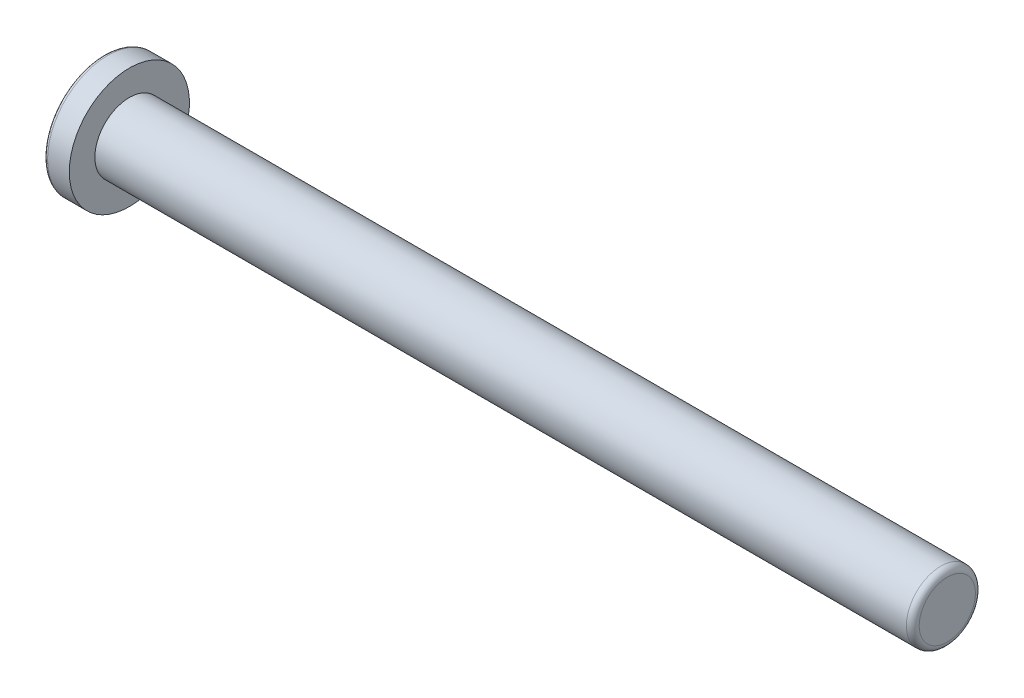
ISO-10303-21;
HEADER;
FILE_DESCRIPTION(('STEP AP214'),'2;1');
FILE_NAME('part.step','',(''),(''),'','','');
FILE_SCHEMA(('AUTOMOTIVE_DESIGN { 1 0 10303 214 1 1 1 1 }'));
ENDSEC;
DATA;
#1=APPLICATION_CONTEXT('core data for automotive mechanical design processes');
#2=APPLICATION_PROTOCOL_DEFINITION('international standard','automotive_design',2000,#1);
#3=PRODUCT_CONTEXT('',#1,'mechanical');
#4=PRODUCT('Part','Part','',(#3));
#5=PRODUCT_RELATED_PRODUCT_CATEGORY('part','',(#4));
#6=PRODUCT_DEFINITION_FORMATION('','',#4);
#7=PRODUCT_DEFINITION_CONTEXT('part definition',#1,'design');
#8=PRODUCT_DEFINITION('design','',#6,#7);
#9=PRODUCT_DEFINITION_SHAPE('','',#8);
#10=(LENGTH_UNIT() NAMED_UNIT(*) SI_UNIT(.MILLI.,.METRE.));
#11=(NAMED_UNIT(*) PLANE_ANGLE_UNIT() SI_UNIT($,.RADIAN.));
#12=(NAMED_UNIT(*) SI_UNIT($,.STERADIAN.) SOLID_ANGLE_UNIT());
#13=UNCERTAINTY_MEASURE_WITH_UNIT(LENGTH_MEASURE(1.E-05),#10,'distance_accuracy_value','');
#14=(GEOMETRIC_REPRESENTATION_CONTEXT(3) GLOBAL_UNCERTAINTY_ASSIGNED_CONTEXT((#13)) GLOBAL_UNIT_ASSIGNED_CONTEXT((#10,
#11,#12)) REPRESENTATION_CONTEXT('',''));
#15=CARTESIAN_POINT('',(0.,0.,0.));
#16=DIRECTION('',(0.,0.,1.));
#17=DIRECTION('',(1.,0.,0.));
#18=AXIS2_PLACEMENT_3D('',#15,#16,#17);
#19=CARTESIAN_POINT('',(0.,0.,0.));
#20=DIRECTION('',(-1.,0.,0.));
#21=DIRECTION('',(0.,0.,1.));
#22=AXIS2_PLACEMENT_3D('',#19,#20,#21);
#23=PLANE('',#22);
#24=CARTESIAN_POINT('',(0.,0.,0.));
#25=DIRECTION('',(-1.,0.,0.));
#26=DIRECTION('',(0.,0.,1.));
#27=AXIS2_PLACEMENT_3D('',#24,#25,#26);
#28=CIRCLE('',#27,22.);
#29=CARTESIAN_POINT('',(0.,0.,22.));
#30=VERTEX_POINT('',#29);
#31=EDGE_CURVE('E10',#30,#30,#28,.F.);
#32=ORIENTED_EDGE('',*,*,#31,.T.);
#33=EDGE_LOOP('',(#32));
#34=FACE_BOUND('',#33,.T.);
#35=ADVANCED_FACE('F39',(#34),#23,.F.);
#36=CARTESIAN_POINT('',(-660.,0.,0.));
#37=DIRECTION('',(-1.,0.,0.));
#38=DIRECTION('',(0.,0.,1.));
#39=AXIS2_PLACEMENT_3D('',#36,#37,#38);
#40=CYLINDRICAL_SURFACE('',#39,27.);
#41=CARTESIAN_POINT('',(-5.,0.,0.));
#42=DIRECTION('',(-1.,0.,0.));
#43=DIRECTION('',(0.,0.,1.));
#44=AXIS2_PLACEMENT_3D('',#41,#42,#43);
#45=CIRCLE('',#44,27.);
#46=CARTESIAN_POINT('',(-5.,0.,27.));
#47=VERTEX_POINT('',#46);
#48=EDGE_CURVE('E47',#47,#47,#45,.T.);
#49=ORIENTED_EDGE('',*,*,#48,.T.);
#50=EDGE_LOOP('',(#49));
#51=FACE_BOUND('',#50,.T.);
#52=CARTESIAN_POINT('',(-640.,0.,0.));
#53=DIRECTION('',(-1.,0.,0.));
#54=DIRECTION('',(0.,0.,1.));
#55=AXIS2_PLACEMENT_3D('',#52,#53,#54);
#56=CIRCLE('',#55,26.9999999999999);
#57=CARTESIAN_POINT('',(-640.,0.,26.9999999999999));
#58=VERTEX_POINT('',#57);
#59=EDGE_CURVE('E65',#58,#58,#56,.T.);
#60=ORIENTED_EDGE('',*,*,#59,.F.);
#61=EDGE_LOOP('',(#60));
#62=FACE_BOUND('',#61,.T.);
#63=ADVANCED_FACE('F80',(#51,#62),#40,.T.);
#64=CARTESIAN_POINT('',(-640.,26.9999999999999,0.));
#65=DIRECTION('',(-1.,0.,0.));
#66=DIRECTION('',(0.,0.,1.));
#67=AXIS2_PLACEMENT_3D('',#64,#65,#66);
#68=PLANE('',#67);
#69=CARTESIAN_POINT('',(-640.,0.,0.));
#70=DIRECTION('',(-1.,0.,0.));
#71=DIRECTION('',(0.,0.,1.));
#72=AXIS2_PLACEMENT_3D('',#69,#70,#71);
#73=CIRCLE('',#72,46.9999999999999);
#74=CARTESIAN_POINT('',(-640.,0.,46.9999999999999));
#75=VERTEX_POINT('',#74);
#76=EDGE_CURVE('E69',#75,#75,#73,.T.);
#77=ORIENTED_EDGE('',*,*,#76,.F.);
#78=EDGE_LOOP('',(#77));
#79=FACE_BOUND('',#78,.T.);
#80=ORIENTED_EDGE('',*,*,#59,.T.);
#81=EDGE_LOOP('',(#80));
#82=FACE_BOUND('',#81,.T.);
#83=ADVANCED_FACE('F77',(#79,#82),#68,.F.);
#84=CARTESIAN_POINT('',(-660.,0.,0.));
#85=DIRECTION('',(-1.,0.,0.));
#86=DIRECTION('',(0.,0.,1.));
#87=AXIS2_PLACEMENT_3D('',#84,#85,#86);
#88=CYLINDRICAL_SURFACE('',#87,46.9999999999999);
#89=CARTESIAN_POINT('',(-657.,0.,0.));
#90=DIRECTION('',(1.,0.,0.));
#91=DIRECTION('',(0.,0.,-1.));
#92=AXIS2_PLACEMENT_3D('',#89,#90,#91);
#93=CIRCLE('',#92,46.9999999999999);
#94=CARTESIAN_POINT('',(-657.,0.,-46.9999999999999));
#95=VERTEX_POINT('',#94);
#96=EDGE_CURVE('E53',#95,#95,#93,.T.);
#97=ORIENTED_EDGE('',*,*,#96,.T.);
#98=EDGE_LOOP('',(#97));
#99=FACE_BOUND('',#98,.T.);
#100=ORIENTED_EDGE('',*,*,#76,.T.);
#101=EDGE_LOOP('',(#100));
#102=FACE_BOUND('',#101,.T.);
#103=ADVANCED_FACE('F75',(#99,#102),#88,.T.);
#104=CARTESIAN_POINT('',(-660.,46.9999999999999,0.));
#105=DIRECTION('',(1.,0.,0.));
#106=DIRECTION('',(0.,0.,-1.));
#107=AXIS2_PLACEMENT_3D('',#104,#105,#106);
#108=PLANE('',#107);
#109=CARTESIAN_POINT('',(-660.,0.,0.));
#110=DIRECTION('',(1.,0.,0.));
#111=DIRECTION('',(0.,0.,-1.));
#112=AXIS2_PLACEMENT_3D('',#109,#110,#111);
#113=CIRCLE('',#112,43.9999999999999);
#114=CARTESIAN_POINT('',(-660.,0.,-43.9999999999999));
#115=VERTEX_POINT('',#114);
#116=EDGE_CURVE('E59',#115,#115,#113,.F.);
#117=ORIENTED_EDGE('',*,*,#116,.T.);
#118=EDGE_LOOP('',(#117));
#119=FACE_BOUND('',#118,.T.);
#120=ADVANCED_FACE('F94',(#119),#108,.F.);
#121=CARTESIAN_POINT('',(-657.,0.,0.));
#122=DIRECTION('',(1.,0.,0.));
#123=DIRECTION('',(0.,0.,-1.));
#124=AXIS2_PLACEMENT_3D('',#121,#122,#123);
#125=TOROIDAL_SURFACE('',#124,43.9999999999999,3.);
#126=ORIENTED_EDGE('',*,*,#96,.F.);
#127=EDGE_LOOP('',(#126));
#128=FACE_BOUND('',#127,.T.);
#129=ORIENTED_EDGE('',*,*,#116,.F.);
#130=EDGE_LOOP('',(#129));
#131=FACE_BOUND('',#130,.T.);
#132=ADVANCED_FACE('F92',(#128,#131),#125,.T.);
#133=CARTESIAN_POINT('',(-5.,0.,0.));
#134=DIRECTION('',(-1.,0.,0.));
#135=DIRECTION('',(0.,0.,1.));
#136=AXIS2_PLACEMENT_3D('',#133,#134,#135);
#137=TOROIDAL_SURFACE('',#136,22.,5.);
#138=ORIENTED_EDGE('',*,*,#31,.F.);
#139=EDGE_LOOP('',(#138));
#140=FACE_BOUND('',#139,.T.);
#141=ORIENTED_EDGE('',*,*,#48,.F.);
#142=EDGE_LOOP('',(#141));
#143=FACE_BOUND('',#142,.T.);
#144=ADVANCED_FACE('F41',(#140,#143),#137,.T.);
#145=CLOSED_SHELL('',(#35,#63,#83,#103,#120,#132,#144));
#146=MANIFOLD_SOLID_BREP('B2',#145);
#147=ADVANCED_BREP_SHAPE_REPRESENTATION('',(#18,#146),#14);
#148=SHAPE_DEFINITION_REPRESENTATION(#9,#147);
ENDSEC;
END-ISO-10303-21;
